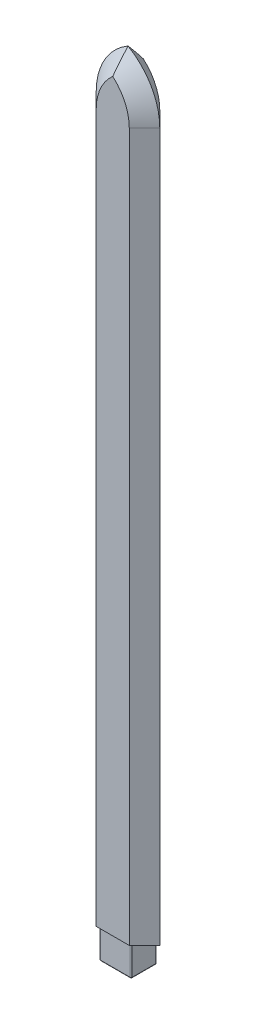
ISO-10303-21;
HEADER;
FILE_DESCRIPTION(('STEP AP214'),'2;1');
FILE_NAME('part.step','',(''),(''),'','','');
FILE_SCHEMA(('AUTOMOTIVE_DESIGN { 1 0 10303 214 1 1 1 1 }'));
ENDSEC;
DATA;
#1=APPLICATION_CONTEXT('core data for automotive mechanical design processes');
#2=APPLICATION_PROTOCOL_DEFINITION('international standard','automotive_design',2000,#1);
#3=PRODUCT_CONTEXT('',#1,'mechanical');
#4=PRODUCT('Part','Part','',(#3));
#5=PRODUCT_RELATED_PRODUCT_CATEGORY('part','',(#4));
#6=PRODUCT_DEFINITION_FORMATION('','',#4);
#7=PRODUCT_DEFINITION_CONTEXT('part definition',#1,'design');
#8=PRODUCT_DEFINITION('design','',#6,#7);
#9=PRODUCT_DEFINITION_SHAPE('','',#8);
#10=(LENGTH_UNIT() NAMED_UNIT(*) SI_UNIT(.MILLI.,.METRE.));
#11=(NAMED_UNIT(*) PLANE_ANGLE_UNIT() SI_UNIT($,.RADIAN.));
#12=(NAMED_UNIT(*) SI_UNIT($,.STERADIAN.) SOLID_ANGLE_UNIT());
#13=UNCERTAINTY_MEASURE_WITH_UNIT(LENGTH_MEASURE(1.E-05),#10,'distance_accuracy_value','');
#14=(GEOMETRIC_REPRESENTATION_CONTEXT(3) GLOBAL_UNCERTAINTY_ASSIGNED_CONTEXT((#13)) GLOBAL_UNIT_ASSIGNED_CONTEXT((#10,
#11,#12)) REPRESENTATION_CONTEXT('',''));
#15=CARTESIAN_POINT('',(0.,0.,0.));
#16=DIRECTION('',(0.,0.,1.));
#17=DIRECTION('',(1.,0.,0.));
#18=AXIS2_PLACEMENT_3D('',#15,#16,#17);
#19=CARTESIAN_POINT('',(0.,-12.192,0.));
#20=DIRECTION('',(0.,1.,0.));
#21=DIRECTION('',(0.,0.,1.));
#22=AXIS2_PLACEMENT_3D('',#19,#20,#21);
#23=PLANE('',#22);
#24=DIRECTION('',(-1.,0.,0.));
#25=VECTOR('',#24,1.);
#26=CARTESIAN_POINT('',(0.,-12.192,4.699));
#27=LINE('',#26,#25);
#28=CARTESIAN_POINT('',(5.969,-12.192,4.699));
#29=VERTEX_POINT('',#28);
#30=CARTESIAN_POINT('',(0.775116281599096,-12.192,4.699));
#31=VERTEX_POINT('',#30);
#32=EDGE_CURVE('E214',#29,#31,#27,.T.);
#33=ORIENTED_EDGE('',*,*,#32,.T.);
#34=CARTESIAN_POINT('',(0.,-12.192,0.));
#35=DIRECTION('',(0.,-1.,0.));
#36=DIRECTION('',(0.,0.,-1.));
#37=AXIS2_PLACEMENT_3D('',#34,#35,#36);
#38=CIRCLE('',#37,4.7625);
#39=CARTESIAN_POINT('',(0.775116281599096,-12.192,-4.699));
#40=VERTEX_POINT('',#39);
#41=EDGE_CURVE('E53',#40,#31,#38,.T.);
#42=ORIENTED_EDGE('',*,*,#41,.F.);
#43=DIRECTION('',(1.,0.,0.));
#44=VECTOR('',#43,1.);
#45=CARTESIAN_POINT('',(0.,-12.192,-4.699));
#46=LINE('',#45,#44);
#47=CARTESIAN_POINT('',(5.969,-12.192,-4.699));
#48=VERTEX_POINT('',#47);
#49=EDGE_CURVE('E41',#40,#48,#46,.T.);
#50=ORIENTED_EDGE('',*,*,#49,.T.);
#51=DIRECTION('',(0.,0.,1.));
#52=VECTOR('',#51,1.);
#53=CARTESIAN_POINT('',(5.969,-12.192,0.));
#54=LINE('',#53,#52);
#55=EDGE_CURVE('E223',#48,#29,#54,.T.);
#56=ORIENTED_EDGE('',*,*,#55,.T.);
#57=EDGE_LOOP('',(#33,#42,#50,#56));
#58=FACE_BOUND('',#57,.T.);
#59=ADVANCED_FACE('F37',(#58),#23,.F.);
#60=CARTESIAN_POINT('',(12.7,0.,6.096));
#61=DIRECTION('',(0.,1.,0.));
#62=DIRECTION('',(0.,0.,1.));
#63=AXIS2_PLACEMENT_3D('',#60,#61,#62);
#64=PLANE('',#63);
#65=CARTESIAN_POINT('',(-5.969,0.,4.699));
#66=DIRECTION('',(0.,1.,0.));
#67=DIRECTION('',(0.,0.,1.));
#68=AXIS2_PLACEMENT_3D('',#65,#66,#67);
#69=CIRCLE('',#68,0.762);
#70=CARTESIAN_POINT('',(-5.969,0.,5.461));
#71=VERTEX_POINT('',#70);
#72=CARTESIAN_POINT('',(-6.731,0.,4.699));
#73=VERTEX_POINT('',#72);
#74=EDGE_CURVE('E459',#71,#73,#69,.F.);
#75=ORIENTED_EDGE('',*,*,#74,.F.);
#76=DIRECTION('',(-1.,0.,0.));
#77=VECTOR('',#76,1.);
#78=CARTESIAN_POINT('',(6.35,0.,5.461));
#79=LINE('',#78,#77);
#80=CARTESIAN_POINT('',(5.969,0.,5.461));
#81=VERTEX_POINT('',#80);
#82=EDGE_CURVE('E487',#71,#81,#79,.F.);
#83=ORIENTED_EDGE('',*,*,#82,.T.);
#84=CARTESIAN_POINT('',(5.969,0.,4.699));
#85=DIRECTION('',(0.,1.,0.));
#86=DIRECTION('',(0.,0.,1.));
#87=AXIS2_PLACEMENT_3D('',#84,#85,#86);
#88=CIRCLE('',#87,0.762);
#89=CARTESIAN_POINT('',(6.731,0.,4.699));
#90=VERTEX_POINT('',#89);
#91=EDGE_CURVE('E485',#90,#81,#88,.F.);
#92=ORIENTED_EDGE('',*,*,#91,.F.);
#93=DIRECTION('',(0.,0.,1.));
#94=VECTOR('',#93,1.);
#95=CARTESIAN_POINT('',(6.731,0.,-5.08));
#96=LINE('',#95,#94);
#97=CARTESIAN_POINT('',(6.731,0.,-4.699));
#98=VERTEX_POINT('',#97);
#99=EDGE_CURVE('E483',#90,#98,#96,.F.);
#100=ORIENTED_EDGE('',*,*,#99,.T.);
#101=CARTESIAN_POINT('',(5.969,0.,-4.699));
#102=DIRECTION('',(0.,1.,0.));
#103=DIRECTION('',(0.,0.,1.));
#104=AXIS2_PLACEMENT_3D('',#101,#102,#103);
#105=CIRCLE('',#104,0.762);
#106=CARTESIAN_POINT('',(5.969,0.,-5.461));
#107=VERTEX_POINT('',#106);
#108=EDGE_CURVE('E480',#107,#98,#105,.F.);
#109=ORIENTED_EDGE('',*,*,#108,.F.);
#110=DIRECTION('',(1.,0.,0.));
#111=VECTOR('',#110,1.);
#112=CARTESIAN_POINT('',(-6.35,0.,-5.461));
#113=LINE('',#112,#111);
#114=CARTESIAN_POINT('',(-5.969,0.,-5.461));
#115=VERTEX_POINT('',#114);
#116=EDGE_CURVE('E478',#107,#115,#113,.F.);
#117=ORIENTED_EDGE('',*,*,#116,.T.);
#118=CARTESIAN_POINT('',(-5.969,0.,-4.699));
#119=DIRECTION('',(0.,1.,0.));
#120=DIRECTION('',(0.,0.,1.));
#121=AXIS2_PLACEMENT_3D('',#118,#119,#120);
#122=CIRCLE('',#121,0.762);
#123=CARTESIAN_POINT('',(-6.731,0.,-4.699));
#124=VERTEX_POINT('',#123);
#125=EDGE_CURVE('E476',#124,#115,#122,.F.);
#126=ORIENTED_EDGE('',*,*,#125,.F.);
#127=DIRECTION('',(0.,0.,-1.));
#128=VECTOR('',#127,1.);
#129=CARTESIAN_POINT('',(-6.731,0.,5.08));
#130=LINE('',#129,#128);
#131=EDGE_CURVE('E424',#124,#73,#130,.F.);
#132=ORIENTED_EDGE('',*,*,#131,.T.);
#133=EDGE_LOOP('',(#75,#83,#92,#100,#109,#117,#126,#132));
#134=FACE_BOUND('',#133,.T.);
#135=DIRECTION('',(0.707106781186546,0.,0.707106781186549));
#136=VECTOR('',#135,1.);
#137=CARTESIAN_POINT('',(-6.60400000000004,0.,6.09600000000001));
#138=LINE('',#137,#136);
#139=CARTESIAN_POINT('',(-6.60400000000005,0.,6.096));
#140=VERTEX_POINT('',#139);
#141=CARTESIAN_POINT('',(-12.7,0.,0.));
#142=VERTEX_POINT('',#141);
#143=EDGE_CURVE('E615',#140,#142,#138,.F.);
#144=ORIENTED_EDGE('',*,*,#143,.T.);
#145=DIRECTION('',(0.707106781186549,0.,-0.707106781186546));
#146=VECTOR('',#145,1.);
#147=CARTESIAN_POINT('',(-12.7,0.,0.));
#148=LINE('',#147,#146);
#149=CARTESIAN_POINT('',(-6.60400000000002,0.,-6.096));
#150=VERTEX_POINT('',#149);
#151=EDGE_CURVE('E622',#142,#150,#148,.T.);
#152=ORIENTED_EDGE('',*,*,#151,.T.);
#153=DIRECTION('',(1.,0.,0.));
#154=VECTOR('',#153,1.);
#155=CARTESIAN_POINT('',(12.7,0.,-6.096));
#156=LINE('',#155,#154);
#157=CARTESIAN_POINT('',(6.60399999999997,0.,-6.096));
#158=VERTEX_POINT('',#157);
#159=EDGE_CURVE('E649',#150,#158,#156,.T.);
#160=ORIENTED_EDGE('',*,*,#159,.T.);
#161=DIRECTION('',(0.707106781186549,0.,0.707106781186546));
#162=VECTOR('',#161,1.);
#163=CARTESIAN_POINT('',(12.7,0.,0.));
#164=LINE('',#163,#162);
#165=CARTESIAN_POINT('',(12.7,0.,0.));
#166=VERTEX_POINT('',#165);
#167=EDGE_CURVE('E605',#158,#166,#164,.T.);
#168=ORIENTED_EDGE('',*,*,#167,.T.);
#169=DIRECTION('',(0.707106781186546,0.,-0.707106781186549));
#170=VECTOR('',#169,1.);
#171=CARTESIAN_POINT('',(6.60400000000001,0.,6.09600000000001));
#172=LINE('',#171,#170);
#173=CARTESIAN_POINT('',(6.60400000000002,0.,6.096));
#174=VERTEX_POINT('',#173);
#175=EDGE_CURVE('E612',#166,#174,#172,.F.);
#176=ORIENTED_EDGE('',*,*,#175,.T.);
#177=DIRECTION('',(1.,0.,0.));
#178=VECTOR('',#177,1.);
#179=CARTESIAN_POINT('',(12.7,0.,6.096));
#180=LINE('',#179,#178);
#181=EDGE_CURVE('E648',#140,#174,#180,.T.);
#182=ORIENTED_EDGE('',*,*,#181,.F.);
#183=EDGE_LOOP('',(#144,#152,#160,#168,#176,#182));
#184=FACE_BOUND('',#183,.T.);
#185=ADVANCED_FACE('F274',(#134,#184),#64,.F.);
#186=CARTESIAN_POINT('',(12.7,282.8036,6.096));
#187=DIRECTION('',(0.,0.,-1.));
#188=DIRECTION('',(-1.,0.,0.));
#189=AXIS2_PLACEMENT_3D('',#186,#187,#188);
#190=PLANE('',#189);
#191=CARTESIAN_POINT('',(12.7,282.8036,6.096));
#192=DIRECTION('',(0.,0.,-1.));
#193=DIRECTION('',(-1.,0.,0.));
#194=AXIS2_PLACEMENT_3D('',#191,#192,#193);
#195=CIRCLE('',#194,19.304);
#196=CARTESIAN_POINT('',(0.,297.341633429594,6.096));
#197=VERTEX_POINT('',#196);
#198=CARTESIAN_POINT('',(-6.60400000000002,282.8036,6.096));
#199=VERTEX_POINT('',#198);
#200=EDGE_CURVE('E228',#197,#199,#195,.F.);
#201=ORIENTED_EDGE('',*,*,#200,.T.);
#202=DIRECTION('',(0.,-1.,0.));
#203=VECTOR('',#202,1.);
#204=CARTESIAN_POINT('',(-6.60400000000002,282.8036,6.096));
#205=LINE('',#204,#203);
#206=EDGE_CURVE('E224',#199,#140,#205,.T.);
#207=ORIENTED_EDGE('',*,*,#206,.T.);
#208=ORIENTED_EDGE('',*,*,#181,.T.);
#209=DIRECTION('',(0.,1.,0.));
#210=VECTOR('',#209,1.);
#211=CARTESIAN_POINT('',(6.60399999999999,282.8036,6.096));
#212=LINE('',#211,#210);
#213=CARTESIAN_POINT('',(6.60399999999999,282.8036,6.096));
#214=VERTEX_POINT('',#213);
#215=EDGE_CURVE('E624',#174,#214,#212,.T.);
#216=ORIENTED_EDGE('',*,*,#215,.T.);
#217=CARTESIAN_POINT('',(-12.7,282.8036,6.096));
#218=DIRECTION('',(0.,0.,-1.));
#219=DIRECTION('',(-1.,0.,0.));
#220=AXIS2_PLACEMENT_3D('',#217,#218,#219);
#221=CIRCLE('',#220,19.304);
#222=EDGE_CURVE('E626',#214,#197,#221,.F.);
#223=ORIENTED_EDGE('',*,*,#222,.T.);
#224=EDGE_LOOP('',(#201,#207,#208,#216,#223));
#225=FACE_BOUND('',#224,.T.);
#226=ADVANCED_FACE('F279',(#225),#190,.F.);
#227=CARTESIAN_POINT('',(12.7,282.8036,-6.096));
#228=DIRECTION('',(0.,0.,-1.));
#229=DIRECTION('',(-1.,0.,0.));
#230=AXIS2_PLACEMENT_3D('',#227,#228,#229);
#231=PLANE('',#230);
#232=ORIENTED_EDGE('',*,*,#159,.F.);
#233=DIRECTION('',(0.,1.,0.));
#234=VECTOR('',#233,1.);
#235=CARTESIAN_POINT('',(-6.60399999999999,282.8036,-6.096));
#236=LINE('',#235,#234);
#237=CARTESIAN_POINT('',(-6.60399999999998,282.8036,-6.096));
#238=VERTEX_POINT('',#237);
#239=EDGE_CURVE('E613',#150,#238,#236,.T.);
#240=ORIENTED_EDGE('',*,*,#239,.T.);
#241=CARTESIAN_POINT('',(12.7,282.8036,-6.096));
#242=DIRECTION('',(0.,0.,-1.));
#243=DIRECTION('',(-1.,0.,0.));
#244=AXIS2_PLACEMENT_3D('',#241,#242,#243);
#245=CIRCLE('',#244,19.304);
#246=CARTESIAN_POINT('',(0.,297.341633429594,-6.096));
#247=VERTEX_POINT('',#246);
#248=EDGE_CURVE('E617',#238,#247,#245,.T.);
#249=ORIENTED_EDGE('',*,*,#248,.T.);
#250=CARTESIAN_POINT('',(-12.7,282.8036,-6.096));
#251=DIRECTION('',(0.,0.,-1.));
#252=DIRECTION('',(-1.,0.,0.));
#253=AXIS2_PLACEMENT_3D('',#250,#251,#252);
#254=CIRCLE('',#253,19.304);
#255=CARTESIAN_POINT('',(6.60399999999994,282.8036,-6.096));
#256=VERTEX_POINT('',#255);
#257=EDGE_CURVE('E640',#247,#256,#254,.T.);
#258=ORIENTED_EDGE('',*,*,#257,.T.);
#259=DIRECTION('',(0.,-1.,0.));
#260=VECTOR('',#259,1.);
#261=CARTESIAN_POINT('',(6.60399999999997,0.,-6.096));
#262=LINE('',#261,#260);
#263=EDGE_CURVE('E607',#256,#158,#262,.T.);
#264=ORIENTED_EDGE('',*,*,#263,.T.);
#265=EDGE_LOOP('',(#232,#240,#249,#258,#264));
#266=FACE_BOUND('',#265,.T.);
#267=ADVANCED_FACE('F529',(#266),#231,.T.);
#268=CARTESIAN_POINT('',(6.60399999999999,282.8036,6.096));
#269=DIRECTION('',(-0.707106781186549,0.,-0.707106781186546));
#270=DIRECTION('',(0.,1.,0.));
#271=AXIS2_PLACEMENT_3D('',#268,#269,#270);
#272=PLANE('',#271);
#273=ORIENTED_EDGE('',*,*,#215,.F.);
#274=ORIENTED_EDGE('',*,*,#175,.F.);
#275=DIRECTION('',(0.,-1.,0.));
#276=VECTOR('',#275,1.);
#277=CARTESIAN_POINT('',(12.7,282.8036,0.));
#278=LINE('',#277,#276);
#279=CARTESIAN_POINT('',(12.7,282.8036,0.));
#280=VERTEX_POINT('',#279);
#281=EDGE_CURVE('E231',#280,#166,#278,.T.);
#282=ORIENTED_EDGE('',*,*,#281,.F.);
#283=DIRECTION('',(0.707106781186546,0.,-0.707106781186549));
#284=VECTOR('',#283,1.);
#285=CARTESIAN_POINT('',(6.60399999999999,282.8036,6.096));
#286=LINE('',#285,#284);
#287=EDGE_CURVE('E884',#214,#280,#286,.T.);
#288=ORIENTED_EDGE('',*,*,#287,.F.);
#289=EDGE_LOOP('',(#273,#274,#282,#288));
#290=FACE_BOUND('',#289,.T.);
#291=ADVANCED_FACE('F371',(#290),#272,.F.);
#292=CARTESIAN_POINT('',(12.7,282.8036,0.));
#293=DIRECTION('',(0.707106781186546,0.,-0.707106781186549));
#294=DIRECTION('',(0.,-1.,0.));
#295=AXIS2_PLACEMENT_3D('',#292,#293,#294);
#296=PLANE('',#295);
#297=ORIENTED_EDGE('',*,*,#167,.F.);
#298=ORIENTED_EDGE('',*,*,#263,.F.);
#299=DIRECTION('',(-0.707106781186549,0.,-0.707106781186546));
#300=VECTOR('',#299,1.);
#301=CARTESIAN_POINT('',(12.7,282.8036,0.));
#302=LINE('',#301,#300);
#303=EDGE_CURVE('E642',#280,#256,#302,.T.);
#304=ORIENTED_EDGE('',*,*,#303,.F.);
#305=ORIENTED_EDGE('',*,*,#281,.T.);
#306=EDGE_LOOP('',(#297,#298,#304,#305));
#307=FACE_BOUND('',#306,.T.);
#308=ADVANCED_FACE('F591',(#307),#296,.T.);
#309=CARTESIAN_POINT('',(-12.7,282.8036,6.096));
#310=DIRECTION('',(0.,0.,-1.));
#311=DIRECTION('',(-1.,0.,0.));
#312=AXIS2_PLACEMENT_3D('',#309,#310,#311);
#313=CONICAL_SURFACE('',#312,19.304,0.785398163397446);
#314=ORIENTED_EDGE('',*,*,#222,.F.);
#315=ORIENTED_EDGE('',*,*,#287,.T.);
#316=CARTESIAN_POINT('',(-12.7,282.8036,0.));
#317=DIRECTION('',(0.,0.,-1.));
#318=DIRECTION('',(-1.,0.,0.));
#319=AXIS2_PLACEMENT_3D('',#316,#317,#318);
#320=CIRCLE('',#319,25.4);
#321=CARTESIAN_POINT('',(0.,304.800645256125,0.));
#322=VERTEX_POINT('',#321);
#323=EDGE_CURVE('E572',#322,#280,#320,.T.);
#324=ORIENTED_EDGE('',*,*,#323,.F.);
#325=CARTESIAN_POINT('',(0.,304.800645256125,0.));
#326=CARTESIAN_POINT('',(0.,304.497146677909,0.262832821845056));
#327=CARTESIAN_POINT('',(0.,304.192981284702,0.524893983363243));
#328=CARTESIAN_POINT('',(0.,303.583155470929,1.04727621377784));
#329=CARTESIAN_POINT('',(0.,303.277495036906,1.30759726696008));
#330=CARTESIAN_POINT('',(0.,302.358212854526,2.08549945285016));
#331=CARTESIAN_POINT('',(0.,301.742116562755,2.6001703908839));
#332=CARTESIAN_POINT('',(0.,300.811784273223,3.36471853820326));
#333=CARTESIAN_POINT('',(0.,300.500622578787,3.61834048095647));
#334=CARTESIAN_POINT('',(0.,299.875990660825,4.12272203765043));
#335=CARTESIAN_POINT('',(0.,299.562520460468,4.37348168025367));
#336=CARTESIAN_POINT('',(0.,298.932899204769,4.87179545091354));
#337=CARTESIAN_POINT('',(0.,298.616747438551,5.11934868202647));
#338=CARTESIAN_POINT('',(0.,297.981489823222,5.61065767468526));
#339=CARTESIAN_POINT('',(0.,297.662383865651,5.85441329591868));
#340=CARTESIAN_POINT('',(0.,297.341633429594,6.09600000000001));
#341=B_SPLINE_CURVE_WITH_KNOTS('',3,(#325,#326,#327,#328,#329,#330,#331,#332,#333,#334,#335,
#336,#337,#338,#339,#340),.UNSPECIFIED.,.F.,.F.,(4,2,2,2,2,2,2,4),(0.,1.20445920643655,
2.40892927516814,4.81717949598103,6.02145500910871,7.2257184522742,8.43031179397944,
9.63494953742671),.UNSPECIFIED.);
#342=EDGE_CURVE('E563',#197,#322,#341,.F.);
#343=ORIENTED_EDGE('',*,*,#342,.F.);
#344=EDGE_LOOP('',(#314,#315,#324,#343));
#345=FACE_BOUND('',#344,.T.);
#346=ADVANCED_FACE('F575',(#345),#313,.T.);
#347=CARTESIAN_POINT('',(-6.60400000000002,282.8036,6.096));
#348=DIRECTION('',(0.707106781186549,0.,-0.707106781186546));
#349=DIRECTION('',(0.,-1.,0.));
#350=AXIS2_PLACEMENT_3D('',#347,#348,#349);
#351=PLANE('',#350);
#352=ORIENTED_EDGE('',*,*,#143,.F.);
#353=ORIENTED_EDGE('',*,*,#206,.F.);
#354=DIRECTION('',(0.707106781186546,0.,0.707106781186549));
#355=VECTOR('',#354,1.);
#356=CARTESIAN_POINT('',(-12.7,282.8036,0.));
#357=LINE('',#356,#355);
#358=CARTESIAN_POINT('',(-12.7,282.8036,0.));
#359=VERTEX_POINT('',#358);
#360=EDGE_CURVE('E560',#359,#199,#357,.T.);
#361=ORIENTED_EDGE('',*,*,#360,.F.);
#362=DIRECTION('',(0.,1.,0.));
#363=VECTOR('',#362,1.);
#364=CARTESIAN_POINT('',(-12.7,0.,0.));
#365=LINE('',#364,#363);
#366=EDGE_CURVE('E555',#142,#359,#365,.T.);
#367=ORIENTED_EDGE('',*,*,#366,.F.);
#368=EDGE_LOOP('',(#352,#353,#361,#367));
#369=FACE_BOUND('',#368,.T.);
#370=ADVANCED_FACE('F543',(#369),#351,.F.);
#371=CARTESIAN_POINT('',(-12.7,282.8036,0.));
#372=DIRECTION('',(0.,0.,1.));
#373=DIRECTION('',(1.,0.,0.));
#374=AXIS2_PLACEMENT_3D('',#371,#372,#373);
#375=CONICAL_SURFACE('',#374,25.4,0.785398163397451);
#376=ORIENTED_EDGE('',*,*,#303,.T.);
#377=ORIENTED_EDGE('',*,*,#257,.F.);
#378=CARTESIAN_POINT('',(0.,297.341633429594,-6.096));
#379=CARTESIAN_POINT('',(0.,297.662383865651,-5.85441329591868));
#380=CARTESIAN_POINT('',(0.,297.981489823222,-5.61065767468525));
#381=CARTESIAN_POINT('',(0.,298.616747438551,-5.11934868202647));
#382=CARTESIAN_POINT('',(0.,298.932899204769,-4.87179545091354));
#383=CARTESIAN_POINT('',(0.,299.562520460468,-4.37348168025368));
#384=CARTESIAN_POINT('',(0.,299.875990660825,-4.12272203765044));
#385=CARTESIAN_POINT('',(0.,300.500622578787,-3.61834048095646));
#386=CARTESIAN_POINT('',(0.,300.811784273223,-3.36471853820324));
#387=CARTESIAN_POINT('',(0.,301.742116562755,-2.60017039088389));
#388=CARTESIAN_POINT('',(0.,302.358212854526,-2.08549945285016));
#389=CARTESIAN_POINT('',(0.,303.277495036906,-1.30759726696009));
#390=CARTESIAN_POINT('',(0.,303.583155470929,-1.04727621377785));
#391=CARTESIAN_POINT('',(0.,304.192981284702,-0.524893983363256));
#392=CARTESIAN_POINT('',(0.,304.497146677909,-0.262832821845071));
#393=CARTESIAN_POINT('',(0.,304.800645256125,0.));
#394=B_SPLINE_CURVE_WITH_KNOTS('',3,(#378,#379,#380,#381,#382,#383,#384,#385,#386,#387,#388,
#389,#390,#391,#392,#393),.UNSPECIFIED.,.F.,.F.,(4,2,2,2,2,2,2,4),(0.,1.20463774344732,
2.40923108515249,3.61349452831804,4.81777004144572,7.22602026225861,8.43049033099019,
9.63494953742673),.UNSPECIFIED.);
#395=EDGE_CURVE('E548',#322,#247,#394,.F.);
#396=ORIENTED_EDGE('',*,*,#395,.F.);
#397=ORIENTED_EDGE('',*,*,#323,.T.);
#398=EDGE_LOOP('',(#376,#377,#396,#397));
#399=FACE_BOUND('',#398,.T.);
#400=ADVANCED_FACE('F535',(#399),#375,.T.);
#401=CARTESIAN_POINT('',(12.7,282.8036,6.096));
#402=DIRECTION('',(0.,0.,-1.));
#403=DIRECTION('',(-1.,0.,0.));
#404=AXIS2_PLACEMENT_3D('',#401,#402,#403);
#405=CONICAL_SURFACE('',#404,19.304,0.785398163397446);
#406=ORIENTED_EDGE('',*,*,#200,.F.);
#407=ORIENTED_EDGE('',*,*,#342,.T.);
#408=CARTESIAN_POINT('',(12.7,282.8036,0.));
#409=DIRECTION('',(0.,0.,-1.));
#410=DIRECTION('',(-1.,0.,0.));
#411=AXIS2_PLACEMENT_3D('',#408,#409,#410);
#412=CIRCLE('',#411,25.4);
#413=EDGE_CURVE('E556',#359,#322,#412,.T.);
#414=ORIENTED_EDGE('',*,*,#413,.F.);
#415=ORIENTED_EDGE('',*,*,#360,.T.);
#416=EDGE_LOOP('',(#406,#407,#414,#415));
#417=FACE_BOUND('',#416,.T.);
#418=ADVANCED_FACE('F542',(#417),#405,.T.);
#419=CARTESIAN_POINT('',(-12.7,0.,0.));
#420=DIRECTION('',(-0.707106781186546,0.,-0.707106781186549));
#421=DIRECTION('',(0.,1.,0.));
#422=AXIS2_PLACEMENT_3D('',#419,#420,#421);
#423=PLANE('',#422);
#424=ORIENTED_EDGE('',*,*,#151,.F.);
#425=ORIENTED_EDGE('',*,*,#366,.T.);
#426=DIRECTION('',(-0.707106781186549,0.,0.707106781186546));
#427=VECTOR('',#426,1.);
#428=CARTESIAN_POINT('',(-6.60399999999999,282.8036,-6.096));
#429=LINE('',#428,#427);
#430=EDGE_CURVE('E352',#238,#359,#429,.T.);
#431=ORIENTED_EDGE('',*,*,#430,.F.);
#432=ORIENTED_EDGE('',*,*,#239,.F.);
#433=EDGE_LOOP('',(#424,#425,#431,#432));
#434=FACE_BOUND('',#433,.T.);
#435=ADVANCED_FACE('F584',(#434),#423,.T.);
#436=CARTESIAN_POINT('',(12.7,282.8036,0.));
#437=DIRECTION('',(0.,0.,1.));
#438=DIRECTION('',(1.,0.,0.));
#439=AXIS2_PLACEMENT_3D('',#436,#437,#438);
#440=CONICAL_SURFACE('',#439,25.4,0.785398163397451);
#441=ORIENTED_EDGE('',*,*,#395,.T.);
#442=ORIENTED_EDGE('',*,*,#248,.F.);
#443=ORIENTED_EDGE('',*,*,#430,.T.);
#444=ORIENTED_EDGE('',*,*,#413,.T.);
#445=EDGE_LOOP('',(#441,#442,#443,#444));
#446=FACE_BOUND('',#445,.T.);
#447=ADVANCED_FACE('F525',(#446),#440,.T.);
#448=CARTESIAN_POINT('',(6.35,-12.192,-5.08));
#449=DIRECTION('',(-1.,0.,0.));
#450=DIRECTION('',(0.,0.,1.));
#451=AXIS2_PLACEMENT_3D('',#448,#449,#450);
#452=PLANE('',#451);
#453=DIRECTION('',(0.,1.,0.));
#454=VECTOR('',#453,1.);
#455=CARTESIAN_POINT('',(6.35,-12.192,4.699));
#456=LINE('',#455,#454);
#457=CARTESIAN_POINT('',(6.35,-0.381000000000005,4.699));
#458=VERTEX_POINT('',#457);
#459=CARTESIAN_POINT('',(6.35,-11.811,4.699));
#460=VERTEX_POINT('',#459);
#461=EDGE_CURVE('E494',#458,#460,#456,.F.);
#462=ORIENTED_EDGE('',*,*,#461,.T.);
#463=DIRECTION('',(0.,0.,1.));
#464=VECTOR('',#463,1.);
#465=CARTESIAN_POINT('',(6.35,-11.811,-5.08));
#466=LINE('',#465,#464);
#467=CARTESIAN_POINT('',(6.35,-11.811,-4.699));
#468=VERTEX_POINT('',#467);
#469=EDGE_CURVE('E496',#460,#468,#466,.F.);
#470=ORIENTED_EDGE('',*,*,#469,.T.);
#471=DIRECTION('',(0.,1.,0.));
#472=VECTOR('',#471,1.);
#473=CARTESIAN_POINT('',(6.35,-12.192,-4.699));
#474=LINE('',#473,#472);
#475=CARTESIAN_POINT('',(6.35,-0.381000000000005,-4.699));
#476=VERTEX_POINT('',#475);
#477=EDGE_CURVE('E490',#468,#476,#474,.T.);
#478=ORIENTED_EDGE('',*,*,#477,.T.);
#479=DIRECTION('',(0.,0.,1.));
#480=VECTOR('',#479,1.);
#481=CARTESIAN_POINT('',(6.35,-0.381000000000005,5.08));
#482=LINE('',#481,#480);
#483=EDGE_CURVE('E492',#476,#458,#482,.T.);
#484=ORIENTED_EDGE('',*,*,#483,.T.);
#485=EDGE_LOOP('',(#462,#470,#478,#484));
#486=FACE_BOUND('',#485,.T.);
#487=ADVANCED_FACE('F520',(#486),#452,.F.);
#488=CARTESIAN_POINT('',(-6.35,-12.192,5.08));
#489=DIRECTION('',(0.,0.,-1.));
#490=DIRECTION('',(-1.,0.,0.));
#491=AXIS2_PLACEMENT_3D('',#488,#489,#490);
#492=PLANE('',#491);
#493=DIRECTION('',(-1.,0.,0.));
#494=VECTOR('',#493,1.);
#495=CARTESIAN_POINT('',(-6.35,-11.811,5.08));
#496=LINE('',#495,#494);
#497=CARTESIAN_POINT('',(-5.969,-11.811,5.08));
#498=VERTEX_POINT('',#497);
#499=CARTESIAN_POINT('',(5.969,-11.811,5.08));
#500=VERTEX_POINT('',#499);
#501=EDGE_CURVE('E460',#498,#500,#496,.F.);
#502=ORIENTED_EDGE('',*,*,#501,.T.);
#503=DIRECTION('',(0.,1.,0.));
#504=VECTOR('',#503,1.);
#505=CARTESIAN_POINT('',(5.969,-12.192,5.08));
#506=LINE('',#505,#504);
#507=CARTESIAN_POINT('',(5.969,-0.381000000000005,5.08));
#508=VERTEX_POINT('',#507);
#509=EDGE_CURVE('E454',#500,#508,#506,.T.);
#510=ORIENTED_EDGE('',*,*,#509,.T.);
#511=DIRECTION('',(-1.,0.,0.));
#512=VECTOR('',#511,1.);
#513=CARTESIAN_POINT('',(-6.35,-0.381000000000005,5.08));
#514=LINE('',#513,#512);
#515=CARTESIAN_POINT('',(-5.969,-0.381000000000005,5.08));
#516=VERTEX_POINT('',#515);
#517=EDGE_CURVE('E468',#508,#516,#514,.T.);
#518=ORIENTED_EDGE('',*,*,#517,.T.);
#519=DIRECTION('',(0.,1.,0.));
#520=VECTOR('',#519,1.);
#521=CARTESIAN_POINT('',(-5.969,-12.192,5.08));
#522=LINE('',#521,#520);
#523=EDGE_CURVE('E465',#516,#498,#522,.F.);
#524=ORIENTED_EDGE('',*,*,#523,.T.);
#525=EDGE_LOOP('',(#502,#510,#518,#524));
#526=FACE_BOUND('',#525,.T.);
#527=ADVANCED_FACE('F463',(#526),#492,.F.);
#528=CARTESIAN_POINT('',(-6.35,-12.192,-5.08));
#529=DIRECTION('',(1.,0.,0.));
#530=DIRECTION('',(0.,0.,-1.));
#531=AXIS2_PLACEMENT_3D('',#528,#529,#530);
#532=PLANE('',#531);
#533=DIRECTION('',(0.,0.,-1.));
#534=VECTOR('',#533,1.);
#535=CARTESIAN_POINT('',(-6.35,-11.811,-5.08));
#536=LINE('',#535,#534);
#537=CARTESIAN_POINT('',(-6.35,-11.811,-4.699));
#538=VERTEX_POINT('',#537);
#539=CARTESIAN_POINT('',(-6.35,-11.811,4.699));
#540=VERTEX_POINT('',#539);
#541=EDGE_CURVE('E61',#538,#540,#536,.F.);
#542=ORIENTED_EDGE('',*,*,#541,.T.);
#543=DIRECTION('',(0.,1.,0.));
#544=VECTOR('',#543,1.);
#545=CARTESIAN_POINT('',(-6.35,-12.192,4.699));
#546=LINE('',#545,#544);
#547=CARTESIAN_POINT('',(-6.35,-0.381000000000005,4.699));
#548=VERTEX_POINT('',#547);
#549=EDGE_CURVE('E47',#540,#548,#546,.T.);
#550=ORIENTED_EDGE('',*,*,#549,.T.);
#551=DIRECTION('',(0.,0.,-1.));
#552=VECTOR('',#551,1.);
#553=CARTESIAN_POINT('',(-6.35,-0.381000000000005,-5.08));
#554=LINE('',#553,#552);
#555=CARTESIAN_POINT('',(-6.35,-0.381000000000005,-4.699));
#556=VERTEX_POINT('',#555);
#557=EDGE_CURVE('E423',#548,#556,#554,.T.);
#558=ORIENTED_EDGE('',*,*,#557,.T.);
#559=DIRECTION('',(0.,1.,0.));
#560=VECTOR('',#559,1.);
#561=CARTESIAN_POINT('',(-6.35,-12.192,-4.699));
#562=LINE('',#561,#560);
#563=EDGE_CURVE('E428',#556,#538,#562,.F.);
#564=ORIENTED_EDGE('',*,*,#563,.T.);
#565=EDGE_LOOP('',(#542,#550,#558,#564));
#566=FACE_BOUND('',#565,.T.);
#567=ADVANCED_FACE('F289',(#566),#532,.F.);
#568=CARTESIAN_POINT('',(-6.35,-12.192,-5.08));
#569=DIRECTION('',(0.,0.,1.));
#570=DIRECTION('',(1.,0.,0.));
#571=AXIS2_PLACEMENT_3D('',#568,#569,#570);
#572=PLANE('',#571);
#573=DIRECTION('',(0.,1.,0.));
#574=VECTOR('',#573,1.);
#575=CARTESIAN_POINT('',(5.969,-12.192,-5.08));
#576=LINE('',#575,#574);
#577=CARTESIAN_POINT('',(5.969,-0.381000000000005,-5.08));
#578=VERTEX_POINT('',#577);
#579=CARTESIAN_POINT('',(5.969,-11.811,-5.08));
#580=VERTEX_POINT('',#579);
#581=EDGE_CURVE('E503',#578,#580,#576,.F.);
#582=ORIENTED_EDGE('',*,*,#581,.T.);
#583=DIRECTION('',(1.,0.,0.));
#584=VECTOR('',#583,1.);
#585=CARTESIAN_POINT('',(-6.35,-11.811,-5.08));
#586=LINE('',#585,#584);
#587=CARTESIAN_POINT('',(-5.969,-11.811,-5.08));
#588=VERTEX_POINT('',#587);
#589=EDGE_CURVE('E431',#580,#588,#586,.F.);
#590=ORIENTED_EDGE('',*,*,#589,.T.);
#591=DIRECTION('',(0.,1.,0.));
#592=VECTOR('',#591,1.);
#593=CARTESIAN_POINT('',(-5.969,-12.192,-5.08));
#594=LINE('',#593,#592);
#595=CARTESIAN_POINT('',(-5.969,-0.381000000000005,-5.08));
#596=VERTEX_POINT('',#595);
#597=EDGE_CURVE('E499',#588,#596,#594,.T.);
#598=ORIENTED_EDGE('',*,*,#597,.T.);
#599=DIRECTION('',(1.,0.,0.));
#600=VECTOR('',#599,1.);
#601=CARTESIAN_POINT('',(6.35,-0.381000000000005,-5.08));
#602=LINE('',#601,#600);
#603=EDGE_CURVE('E501',#596,#578,#602,.T.);
#604=ORIENTED_EDGE('',*,*,#603,.T.);
#605=EDGE_LOOP('',(#582,#590,#598,#604));
#606=FACE_BOUND('',#605,.T.);
#607=ADVANCED_FACE('F285',(#606),#572,.F.);
#608=CARTESIAN_POINT('',(-5.969,-12.192,-4.699));
#609=VERTEX_POINT('',#608);
#610=CARTESIAN_POINT('',(-0.775116281599096,-12.192,-4.699));
#611=VERTEX_POINT('',#610);
#612=EDGE_CURVE('E221',#609,#611,#46,.T.);
#613=ORIENTED_EDGE('',*,*,#612,.T.);
#614=CARTESIAN_POINT('',(-0.775116281599096,-12.192,4.699));
#615=VERTEX_POINT('',#614);
#616=EDGE_CURVE('E200',#615,#611,#38,.T.);
#617=ORIENTED_EDGE('',*,*,#616,.F.);
#618=CARTESIAN_POINT('',(-5.969,-12.192,4.699));
#619=VERTEX_POINT('',#618);
#620=EDGE_CURVE('E511',#615,#619,#27,.T.);
#621=ORIENTED_EDGE('',*,*,#620,.T.);
#622=DIRECTION('',(0.,0.,-1.));
#623=VECTOR('',#622,1.);
#624=CARTESIAN_POINT('',(-5.969,-12.192,0.));
#625=LINE('',#624,#623);
#626=EDGE_CURVE('E222',#619,#609,#625,.T.);
#627=ORIENTED_EDGE('',*,*,#626,.T.);
#628=EDGE_LOOP('',(#613,#617,#621,#627));
#629=FACE_BOUND('',#628,.T.);
#630=ADVANCED_FACE('F270',(#629),#23,.F.);
#631=CARTESIAN_POINT('',(-6.35,-0.381000000000005,-5.461));
#632=DIRECTION('',(-1.,0.,0.));
#633=DIRECTION('',(0.,0.,1.));
#634=AXIS2_PLACEMENT_3D('',#631,#632,#633);
#635=CYLINDRICAL_SURFACE('',#634,0.381);
#636=CARTESIAN_POINT('',(-5.969,-0.381000000000005,-5.461));
#637=DIRECTION('',(1.,0.,0.));
#638=DIRECTION('',(0.,0.,-1.));
#639=AXIS2_PLACEMENT_3D('',#636,#637,#638);
#640=CIRCLE('',#639,0.381);
#641=EDGE_CURVE('E347',#115,#596,#640,.T.);
#642=ORIENTED_EDGE('',*,*,#641,.F.);
#643=ORIENTED_EDGE('',*,*,#116,.F.);
#644=CARTESIAN_POINT('',(5.969,-0.381000000000005,-5.461));
#645=DIRECTION('',(-1.,0.,0.));
#646=DIRECTION('',(0.,0.,1.));
#647=AXIS2_PLACEMENT_3D('',#644,#645,#646);
#648=CIRCLE('',#647,0.381);
#649=EDGE_CURVE('E350',#578,#107,#648,.T.);
#650=ORIENTED_EDGE('',*,*,#649,.F.);
#651=ORIENTED_EDGE('',*,*,#603,.F.);
#652=EDGE_LOOP('',(#642,#643,#650,#651));
#653=FACE_BOUND('',#652,.T.);
#654=ADVANCED_FACE('F39',(#653),#635,.F.);
#655=CARTESIAN_POINT('',(5.969,-0.381000000000005,-4.699));
#656=DIRECTION('',(0.,1.,0.));
#657=DIRECTION('',(0.,0.,1.));
#658=AXIS2_PLACEMENT_3D('',#655,#656,#657);
#659=TOROIDAL_SURFACE('',#658,0.762,0.381);
#660=ORIENTED_EDGE('',*,*,#649,.T.);
#661=ORIENTED_EDGE('',*,*,#108,.T.);
#662=CARTESIAN_POINT('',(6.731,-0.381000000000005,-4.699));
#663=DIRECTION('',(0.,0.,1.));
#664=DIRECTION('',(1.,0.,0.));
#665=AXIS2_PLACEMENT_3D('',#662,#663,#664);
#666=CIRCLE('',#665,0.381);
#667=EDGE_CURVE('E344',#476,#98,#666,.F.);
#668=ORIENTED_EDGE('',*,*,#667,.F.);
#669=CARTESIAN_POINT('',(5.969,-0.381000000000005,-4.699));
#670=DIRECTION('',(0.,1.,0.));
#671=DIRECTION('',(0.,0.,1.));
#672=AXIS2_PLACEMENT_3D('',#669,#670,#671);
#673=CIRCLE('',#672,0.381);
#674=EDGE_CURVE('E341',#578,#476,#673,.F.);
#675=ORIENTED_EDGE('',*,*,#674,.F.);
#676=EDGE_LOOP('',(#660,#661,#668,#675));
#677=FACE_BOUND('',#676,.T.);
#678=ADVANCED_FACE('F263',(#677),#659,.F.);
#679=CARTESIAN_POINT('',(-5.969,-0.381000000000005,-4.699));
#680=DIRECTION('',(0.,1.,0.));
#681=DIRECTION('',(0.,0.,1.));
#682=AXIS2_PLACEMENT_3D('',#679,#680,#681);
#683=TOROIDAL_SURFACE('',#682,0.762,0.381);
#684=ORIENTED_EDGE('',*,*,#125,.T.);
#685=ORIENTED_EDGE('',*,*,#641,.T.);
#686=CARTESIAN_POINT('',(-5.969,-0.381000000000005,-4.699));
#687=DIRECTION('',(0.,1.,0.));
#688=DIRECTION('',(0.,0.,1.));
#689=AXIS2_PLACEMENT_3D('',#686,#687,#688);
#690=CIRCLE('',#689,0.381);
#691=EDGE_CURVE('E338',#556,#596,#690,.F.);
#692=ORIENTED_EDGE('',*,*,#691,.F.);
#693=CARTESIAN_POINT('',(-6.731,-0.381000000000005,-4.699));
#694=DIRECTION('',(0.,0.,1.));
#695=DIRECTION('',(1.,0.,0.));
#696=AXIS2_PLACEMENT_3D('',#693,#694,#695);
#697=CIRCLE('',#696,0.381);
#698=EDGE_CURVE('E335',#124,#556,#697,.F.);
#699=ORIENTED_EDGE('',*,*,#698,.F.);
#700=EDGE_LOOP('',(#684,#685,#692,#699));
#701=FACE_BOUND('',#700,.T.);
#702=ADVANCED_FACE('F260',(#701),#683,.F.);
#703=CARTESIAN_POINT('',(6.731,-0.381000000000005,-5.08));
#704=DIRECTION('',(0.,0.,-1.));
#705=DIRECTION('',(-1.,0.,0.));
#706=AXIS2_PLACEMENT_3D('',#703,#704,#705);
#707=CYLINDRICAL_SURFACE('',#706,0.381);
#708=ORIENTED_EDGE('',*,*,#667,.T.);
#709=ORIENTED_EDGE('',*,*,#99,.F.);
#710=CARTESIAN_POINT('',(6.731,-0.381000000000005,4.699));
#711=DIRECTION('',(0.,0.,-1.));
#712=DIRECTION('',(-1.,0.,0.));
#713=AXIS2_PLACEMENT_3D('',#710,#711,#712);
#714=CIRCLE('',#713,0.381);
#715=EDGE_CURVE('E329',#458,#90,#714,.T.);
#716=ORIENTED_EDGE('',*,*,#715,.F.);
#717=ORIENTED_EDGE('',*,*,#483,.F.);
#718=EDGE_LOOP('',(#708,#709,#716,#717));
#719=FACE_BOUND('',#718,.T.);
#720=ADVANCED_FACE('F256',(#719),#707,.F.);
#721=CARTESIAN_POINT('',(5.969,-12.192,-4.699));
#722=DIRECTION('',(0.,1.,0.));
#723=DIRECTION('',(0.,0.,1.));
#724=AXIS2_PLACEMENT_3D('',#721,#722,#723);
#725=CYLINDRICAL_SURFACE('',#724,0.381);
#726=ORIENTED_EDGE('',*,*,#674,.T.);
#727=ORIENTED_EDGE('',*,*,#477,.F.);
#728=CARTESIAN_POINT('',(5.969,-11.811,-4.699));
#729=DIRECTION('',(0.,-1.,0.));
#730=DIRECTION('',(0.,0.,-1.));
#731=AXIS2_PLACEMENT_3D('',#728,#729,#730);
#732=CIRCLE('',#731,0.381);
#733=EDGE_CURVE('E326',#580,#468,#732,.T.);
#734=ORIENTED_EDGE('',*,*,#733,.F.);
#735=ORIENTED_EDGE('',*,*,#581,.F.);
#736=EDGE_LOOP('',(#726,#727,#734,#735));
#737=FACE_BOUND('',#736,.T.);
#738=ADVANCED_FACE('F252',(#737),#725,.T.);
#739=CARTESIAN_POINT('',(0.,-11.811,-4.699));
#740=DIRECTION('',(1.,0.,0.));
#741=DIRECTION('',(0.,0.,-1.));
#742=AXIS2_PLACEMENT_3D('',#739,#740,#741);
#743=CYLINDRICAL_SURFACE('',#742,0.381);
#744=CARTESIAN_POINT('',(-0.775116281599098,-12.192,-4.699));
#745=CARTESIAN_POINT('',(-0.732438551921778,-12.1920015660377,-4.70604000063796));
#746=CARTESIAN_POINT('',(-0.689664888393959,-12.1919514407889,-4.7124982689638));
#747=CARTESIAN_POINT('',(-0.603957509336981,-12.1917525068427,-4.72424725542567));
#748=CARTESIAN_POINT('',(-0.561023792975897,-12.1916036976315,-4.72953796748434));
#749=CARTESIAN_POINT('',(-0.475028121279669,-12.1912120929279,-4.7389477314524));
#750=CARTESIAN_POINT('',(-0.43196616461416,-12.190969296457,-4.74306677116379));
#751=CARTESIAN_POINT('',(-0.345746155133277,-12.1903662321795,-4.75013019022459));
#752=CARTESIAN_POINT('',(-0.302588100827825,-12.1900059625386,-4.75307455123022));
#753=CARTESIAN_POINT('',(-0.216207291280686,-12.189257200058,-4.75778641616514));
#754=CARTESIAN_POINT('',(-0.172984534710638,-12.1888687066308,-4.75955389559108));
#755=CARTESIAN_POINT('',(-0.0865088031423146,-12.1877299822884,-4.76191070853469));
#756=CARTESIAN_POINT('',(-0.0432558273869112,-12.1869797419596,-4.76250001139127));
#757=CARTESIAN_POINT('',(0.0246682736995079,-12.1864950329277,-4.7624999935037));
#758=CARTESIAN_POINT('',(0.0493374748301575,-12.1864626085994,-4.76230832536258));
#759=CARTESIAN_POINT('',(0.11725565516548,-12.1865947943045,-4.76125284224678));
#760=CARTESIAN_POINT('',(0.160498164667697,-12.1869262802469,-4.75999138468539));
#761=CARTESIAN_POINT('',(0.265504431868942,-12.1878149472717,-4.75549557738747));
#762=CARTESIAN_POINT('',(0.327242269228271,-12.1884079029387,-4.75164638863919));
#763=CARTESIAN_POINT('',(0.446114826138897,-12.1895793193927,-4.74190738804508));
#764=CARTESIAN_POINT('',(0.503263203007245,-12.1901557877829,-4.7361830644993));
#765=CARTESIAN_POINT('',(0.603240529966197,-12.1910633887939,-4.72433887531521));
#766=CARTESIAN_POINT('',(0.646122449040282,-12.1914199570475,-4.71866533282641));
#767=CARTESIAN_POINT('',(0.717691659911277,-12.1918353754402,-4.70820248317033));
#768=CARTESIAN_POINT('',(0.746425568112853,-12.1919534968604,-4.70373267637773));
#769=CARTESIAN_POINT('',(0.775116281599095,-12.192,-4.699));
#770=B_SPLINE_CURVE_WITH_KNOTS('',3,(#744,#745,#746,#747,#748,#749,#750,#751,#752,#753,#754,
#755,#756,#757,#758,#759,#760,#761,#762,#763,#764,#765,#766,#767,#768,#769),.UNSPECIFIED.,.F.,
.F.,(4,2,2,2,2,2,2,2,2,2,2,2,4),(0.,0.129759357544638,0.259519390497259,0.389280774301272,
0.519044184378986,0.648810296121057,0.778579784875966,0.852585750310815,0.982355574194122,
1.16788828052203,1.34016214867492,1.46991703771065,1.5571513440589),.UNSPECIFIED.);
#771=EDGE_CURVE('E195',#611,#40,#770,.T.);
#772=ORIENTED_EDGE('',*,*,#771,.F.);
#773=ORIENTED_EDGE('',*,*,#612,.F.);
#774=CARTESIAN_POINT('',(-5.969,-11.811,-4.699));
#775=DIRECTION('',(-1.,0.,0.));
#776=DIRECTION('',(0.,0.,1.));
#777=AXIS2_PLACEMENT_3D('',#774,#775,#776);
#778=CIRCLE('',#777,0.381);
#779=EDGE_CURVE('E294',#588,#609,#778,.T.);
#780=ORIENTED_EDGE('',*,*,#779,.F.);
#781=ORIENTED_EDGE('',*,*,#589,.F.);
#782=CARTESIAN_POINT('',(5.969,-11.811,-4.699));
#783=DIRECTION('',(1.,0.,0.));
#784=DIRECTION('',(0.,0.,-1.));
#785=AXIS2_PLACEMENT_3D('',#782,#783,#784);
#786=CIRCLE('',#785,0.381);
#787=EDGE_CURVE('E219',#48,#580,#786,.T.);
#788=ORIENTED_EDGE('',*,*,#787,.F.);
#789=ORIENTED_EDGE('',*,*,#49,.F.);
#790=EDGE_LOOP('',(#772,#773,#780,#781,#788,#789));
#791=FACE_BOUND('',#790,.T.);
#792=ADVANCED_FACE('F216',(#791),#743,.T.);
#793=CARTESIAN_POINT('',(-5.969,-12.192,-4.699));
#794=DIRECTION('',(0.,1.,0.));
#795=DIRECTION('',(0.,0.,1.));
#796=AXIS2_PLACEMENT_3D('',#793,#794,#795);
#797=CYLINDRICAL_SURFACE('',#796,0.381);
#798=ORIENTED_EDGE('',*,*,#691,.T.);
#799=ORIENTED_EDGE('',*,*,#597,.F.);
#800=CARTESIAN_POINT('',(-5.969,-11.811,-4.699));
#801=DIRECTION('',(0.,-1.,0.));
#802=DIRECTION('',(0.,0.,-1.));
#803=AXIS2_PLACEMENT_3D('',#800,#801,#802);
#804=CIRCLE('',#803,0.381);
#805=EDGE_CURVE('E302',#538,#588,#804,.T.);
#806=ORIENTED_EDGE('',*,*,#805,.F.);
#807=ORIENTED_EDGE('',*,*,#563,.F.);
#808=EDGE_LOOP('',(#798,#799,#806,#807));
#809=FACE_BOUND('',#808,.T.);
#810=ADVANCED_FACE('F251',(#809),#797,.T.);
#811=CARTESIAN_POINT('',(-6.731,-0.381000000000005,-5.08));
#812=DIRECTION('',(0.,0.,1.));
#813=DIRECTION('',(1.,0.,0.));
#814=AXIS2_PLACEMENT_3D('',#811,#812,#813);
#815=CYLINDRICAL_SURFACE('',#814,0.381);
#816=ORIENTED_EDGE('',*,*,#698,.T.);
#817=ORIENTED_EDGE('',*,*,#557,.F.);
#818=CARTESIAN_POINT('',(-6.731,-0.381000000000005,4.699));
#819=DIRECTION('',(0.,0.,-1.));
#820=DIRECTION('',(-1.,0.,0.));
#821=AXIS2_PLACEMENT_3D('',#818,#819,#820);
#822=CIRCLE('',#821,0.381);
#823=EDGE_CURVE('E321',#73,#548,#822,.T.);
#824=ORIENTED_EDGE('',*,*,#823,.F.);
#825=ORIENTED_EDGE('',*,*,#131,.F.);
#826=EDGE_LOOP('',(#816,#817,#824,#825));
#827=FACE_BOUND('',#826,.T.);
#828=ADVANCED_FACE('F410',(#827),#815,.F.);
#829=CARTESIAN_POINT('',(-6.35,-0.381000000000005,5.461));
#830=DIRECTION('',(1.,0.,0.));
#831=DIRECTION('',(0.,0.,-1.));
#832=AXIS2_PLACEMENT_3D('',#829,#830,#831);
#833=CYLINDRICAL_SURFACE('',#832,0.381);
#834=CARTESIAN_POINT('',(5.969,-0.381000000000005,5.461));
#835=DIRECTION('',(-1.,0.,0.));
#836=DIRECTION('',(0.,0.,1.));
#837=AXIS2_PLACEMENT_3D('',#834,#835,#836);
#838=CIRCLE('',#837,0.381);
#839=EDGE_CURVE('E332',#81,#508,#838,.T.);
#840=ORIENTED_EDGE('',*,*,#839,.F.);
#841=ORIENTED_EDGE('',*,*,#82,.F.);
#842=CARTESIAN_POINT('',(-5.969,-0.381000000000005,5.461));
#843=DIRECTION('',(1.,0.,0.));
#844=DIRECTION('',(0.,0.,-1.));
#845=AXIS2_PLACEMENT_3D('',#842,#843,#844);
#846=CIRCLE('',#845,0.381);
#847=EDGE_CURVE('E318',#516,#71,#846,.T.);
#848=ORIENTED_EDGE('',*,*,#847,.F.);
#849=ORIENTED_EDGE('',*,*,#517,.F.);
#850=EDGE_LOOP('',(#840,#841,#848,#849));
#851=FACE_BOUND('',#850,.T.);
#852=ADVANCED_FACE('F407',(#851),#833,.F.);
#853=CARTESIAN_POINT('',(5.969,-0.381000000000005,4.699));
#854=DIRECTION('',(0.,1.,0.));
#855=DIRECTION('',(0.,0.,1.));
#856=AXIS2_PLACEMENT_3D('',#853,#854,#855);
#857=TOROIDAL_SURFACE('',#856,0.762,0.381);
#858=ORIENTED_EDGE('',*,*,#91,.T.);
#859=ORIENTED_EDGE('',*,*,#839,.T.);
#860=CARTESIAN_POINT('',(5.969,-0.381000000000005,4.699));
#861=DIRECTION('',(0.,1.,0.));
#862=DIRECTION('',(0.,0.,1.));
#863=AXIS2_PLACEMENT_3D('',#860,#861,#862);
#864=CIRCLE('',#863,0.381);
#865=EDGE_CURVE('E310',#458,#508,#864,.F.);
#866=ORIENTED_EDGE('',*,*,#865,.F.);
#867=ORIENTED_EDGE('',*,*,#715,.T.);
#868=EDGE_LOOP('',(#858,#859,#866,#867));
#869=FACE_BOUND('',#868,.T.);
#870=ADVANCED_FACE('F403',(#869),#857,.F.);
#871=CARTESIAN_POINT('',(5.969,-11.811,-4.699));
#872=DIRECTION('',(0.,0.,1.));
#873=DIRECTION('',(1.,0.,0.));
#874=AXIS2_PLACEMENT_3D('',#871,#872,#873);
#875=SPHERICAL_SURFACE('',#874,0.381);
#876=ORIENTED_EDGE('',*,*,#787,.T.);
#877=ORIENTED_EDGE('',*,*,#733,.T.);
#878=CARTESIAN_POINT('',(5.969,-11.811,-4.699));
#879=DIRECTION('',(0.,0.,-1.));
#880=DIRECTION('',(-1.,0.,0.));
#881=AXIS2_PLACEMENT_3D('',#878,#879,#880);
#882=CIRCLE('',#881,0.381);
#883=EDGE_CURVE('E307',#48,#468,#882,.F.);
#884=ORIENTED_EDGE('',*,*,#883,.F.);
#885=EDGE_LOOP('',(#876,#877,#884));
#886=FACE_BOUND('',#885,.T.);
#887=ADVANCED_FACE('F400',(#886),#875,.T.);
#888=CARTESIAN_POINT('',(-5.969,-11.811,-4.699));
#889=DIRECTION('',(0.,0.,1.));
#890=DIRECTION('',(1.,0.,0.));
#891=AXIS2_PLACEMENT_3D('',#888,#889,#890);
#892=SPHERICAL_SURFACE('',#891,0.381);
#893=ORIENTED_EDGE('',*,*,#805,.T.);
#894=ORIENTED_EDGE('',*,*,#779,.T.);
#895=CARTESIAN_POINT('',(-5.969,-11.811,-4.699));
#896=DIRECTION('',(0.,0.,-1.));
#897=DIRECTION('',(-1.,0.,0.));
#898=AXIS2_PLACEMENT_3D('',#895,#896,#897);
#899=CIRCLE('',#898,0.381);
#900=EDGE_CURVE('E300',#538,#609,#899,.F.);
#901=ORIENTED_EDGE('',*,*,#900,.F.);
#902=EDGE_LOOP('',(#893,#894,#901));
#903=FACE_BOUND('',#902,.T.);
#904=ADVANCED_FACE('F299',(#903),#892,.T.);
#905=CARTESIAN_POINT('',(-5.969,-0.381000000000005,4.699));
#906=DIRECTION('',(0.,1.,0.));
#907=DIRECTION('',(0.,0.,1.));
#908=AXIS2_PLACEMENT_3D('',#905,#906,#907);
#909=TOROIDAL_SURFACE('',#908,0.762,0.381);
#910=ORIENTED_EDGE('',*,*,#74,.T.);
#911=ORIENTED_EDGE('',*,*,#823,.T.);
#912=CARTESIAN_POINT('',(-5.969,-0.381000000000005,4.699));
#913=DIRECTION('',(0.,1.,0.));
#914=DIRECTION('',(0.,0.,1.));
#915=AXIS2_PLACEMENT_3D('',#912,#913,#914);
#916=CIRCLE('',#915,0.381);
#917=EDGE_CURVE('E308',#516,#548,#916,.F.);
#918=ORIENTED_EDGE('',*,*,#917,.F.);
#919=ORIENTED_EDGE('',*,*,#847,.T.);
#920=EDGE_LOOP('',(#910,#911,#918,#919));
#921=FACE_BOUND('',#920,.T.);
#922=ADVANCED_FACE('F393',(#921),#909,.F.);
#923=CARTESIAN_POINT('',(5.969,-12.192,4.699));
#924=DIRECTION('',(0.,1.,0.));
#925=DIRECTION('',(0.,0.,1.));
#926=AXIS2_PLACEMENT_3D('',#923,#924,#925);
#927=CYLINDRICAL_SURFACE('',#926,0.381);
#928=ORIENTED_EDGE('',*,*,#865,.T.);
#929=ORIENTED_EDGE('',*,*,#509,.F.);
#930=CARTESIAN_POINT('',(5.969,-11.811,4.699));
#931=DIRECTION('',(0.,-1.,0.));
#932=DIRECTION('',(0.,0.,-1.));
#933=AXIS2_PLACEMENT_3D('',#930,#931,#932);
#934=CIRCLE('',#933,0.381);
#935=EDGE_CURVE('E312',#460,#500,#934,.T.);
#936=ORIENTED_EDGE('',*,*,#935,.F.);
#937=ORIENTED_EDGE('',*,*,#461,.F.);
#938=EDGE_LOOP('',(#928,#929,#936,#937));
#939=FACE_BOUND('',#938,.T.);
#940=ADVANCED_FACE('F389',(#939),#927,.T.);
#941=CARTESIAN_POINT('',(5.969,-11.811,0.));
#942=DIRECTION('',(0.,0.,1.));
#943=DIRECTION('',(1.,0.,0.));
#944=AXIS2_PLACEMENT_3D('',#941,#942,#943);
#945=CYLINDRICAL_SURFACE('',#944,0.381);
#946=ORIENTED_EDGE('',*,*,#883,.T.);
#947=ORIENTED_EDGE('',*,*,#469,.F.);
#948=CARTESIAN_POINT('',(5.969,-11.811,4.699));
#949=DIRECTION('',(0.,0.,1.));
#950=DIRECTION('',(1.,0.,0.));
#951=AXIS2_PLACEMENT_3D('',#948,#949,#950);
#952=CIRCLE('',#951,0.381);
#953=EDGE_CURVE('E446',#29,#460,#952,.T.);
#954=ORIENTED_EDGE('',*,*,#953,.F.);
#955=ORIENTED_EDGE('',*,*,#55,.F.);
#956=EDGE_LOOP('',(#946,#947,#954,#955));
#957=FACE_BOUND('',#956,.T.);
#958=ADVANCED_FACE('F386',(#957),#945,.T.);
#959=CARTESIAN_POINT('',(-5.969,-11.811,0.));
#960=DIRECTION('',(0.,0.,-1.));
#961=DIRECTION('',(-1.,0.,0.));
#962=AXIS2_PLACEMENT_3D('',#959,#960,#961);
#963=CYLINDRICAL_SURFACE('',#962,0.381);
#964=ORIENTED_EDGE('',*,*,#900,.T.);
#965=ORIENTED_EDGE('',*,*,#626,.F.);
#966=CARTESIAN_POINT('',(-5.969,-11.811,4.699));
#967=DIRECTION('',(0.,0.,1.));
#968=DIRECTION('',(0.,-1.,0.));
#969=AXIS2_PLACEMENT_3D('',#966,#967,#968);
#970=CIRCLE('',#969,0.381);
#971=EDGE_CURVE('E443',#540,#619,#970,.T.);
#972=ORIENTED_EDGE('',*,*,#971,.F.);
#973=ORIENTED_EDGE('',*,*,#541,.F.);
#974=EDGE_LOOP('',(#964,#965,#972,#973));
#975=FACE_BOUND('',#974,.T.);
#976=ADVANCED_FACE('F305',(#975),#963,.T.);
#977=CARTESIAN_POINT('',(-5.969,-12.192,4.699));
#978=DIRECTION('',(0.,1.,0.));
#979=DIRECTION('',(0.,0.,1.));
#980=AXIS2_PLACEMENT_3D('',#977,#978,#979);
#981=CYLINDRICAL_SURFACE('',#980,0.381);
#982=ORIENTED_EDGE('',*,*,#917,.T.);
#983=ORIENTED_EDGE('',*,*,#549,.F.);
#984=CARTESIAN_POINT('',(-5.969,-11.811,4.699));
#985=DIRECTION('',(0.,-1.,0.));
#986=DIRECTION('',(0.,0.,-1.));
#987=AXIS2_PLACEMENT_3D('',#984,#985,#986);
#988=CIRCLE('',#987,0.381);
#989=EDGE_CURVE('E440',#498,#540,#988,.T.);
#990=ORIENTED_EDGE('',*,*,#989,.F.);
#991=ORIENTED_EDGE('',*,*,#523,.F.);
#992=EDGE_LOOP('',(#982,#983,#990,#991));
#993=FACE_BOUND('',#992,.T.);
#994=ADVANCED_FACE('F379',(#993),#981,.T.);
#995=CARTESIAN_POINT('',(5.969,-11.811,4.699));
#996=DIRECTION('',(0.,0.,1.));
#997=DIRECTION('',(1.,0.,0.));
#998=AXIS2_PLACEMENT_3D('',#995,#996,#997);
#999=SPHERICAL_SURFACE('',#998,0.381);
#1000=ORIENTED_EDGE('',*,*,#953,.T.);
#1001=ORIENTED_EDGE('',*,*,#935,.T.);
#1002=CARTESIAN_POINT('',(5.969,-11.811,4.699));
#1003=DIRECTION('',(1.,0.,0.));
#1004=DIRECTION('',(0.,1.,0.));
#1005=AXIS2_PLACEMENT_3D('',#1002,#1003,#1004);
#1006=CIRCLE('',#1005,0.381);
#1007=EDGE_CURVE('E438',#29,#500,#1006,.F.);
#1008=ORIENTED_EDGE('',*,*,#1007,.F.);
#1009=EDGE_LOOP('',(#1000,#1001,#1008));
#1010=FACE_BOUND('',#1009,.T.);
#1011=ADVANCED_FACE('F375',(#1010),#999,.T.);
#1012=CARTESIAN_POINT('',(-5.969,-11.811,4.699));
#1013=DIRECTION('',(0.,0.,1.));
#1014=DIRECTION('',(1.,0.,0.));
#1015=AXIS2_PLACEMENT_3D('',#1012,#1013,#1014);
#1016=SPHERICAL_SURFACE('',#1015,0.381);
#1017=ORIENTED_EDGE('',*,*,#989,.T.);
#1018=ORIENTED_EDGE('',*,*,#971,.T.);
#1019=CARTESIAN_POINT('',(-5.969,-11.811,4.699));
#1020=DIRECTION('',(-1.,0.,0.));
#1021=DIRECTION('',(0.,0.,1.));
#1022=AXIS2_PLACEMENT_3D('',#1019,#1020,#1021);
#1023=CIRCLE('',#1022,0.381);
#1024=EDGE_CURVE('E206',#498,#619,#1023,.F.);
#1025=ORIENTED_EDGE('',*,*,#1024,.F.);
#1026=EDGE_LOOP('',(#1017,#1018,#1025));
#1027=FACE_BOUND('',#1026,.T.);
#1028=ADVANCED_FACE('F369',(#1027),#1016,.T.);
#1029=CARTESIAN_POINT('',(0.,-11.811,4.699));
#1030=DIRECTION('',(-1.,0.,0.));
#1031=DIRECTION('',(0.,0.,1.));
#1032=AXIS2_PLACEMENT_3D('',#1029,#1030,#1031);
#1033=CYLINDRICAL_SURFACE('',#1032,0.381);
#1034=CARTESIAN_POINT('',(0.775116281599095,-12.192,4.699));
#1035=CARTESIAN_POINT('',(0.732433643494975,-12.1920015666622,4.70604081037318));
#1036=CARTESIAN_POINT('',(0.689655049457547,-12.1919514410983,4.71249975454633));
#1037=CARTESIAN_POINT('',(0.603937776225182,-12.1917525065157,4.72424982363672));
#1038=CARTESIAN_POINT('',(0.560999096198338,-12.1916036969835,4.72954094247659));
#1039=CARTESIAN_POINT('',(0.474993475024023,-12.1912120935052,4.73895124965064));
#1040=CARTESIAN_POINT('',(0.431926532546263,-12.190969298581,4.74307042578681));
#1041=CARTESIAN_POINT('',(0.345696540333573,-12.1903662298962,4.75013384656114));
#1042=CARTESIAN_POINT('',(0.302533489108732,-12.1900059543017,4.75307807285552));
#1043=CARTESIAN_POINT('',(0.21614268576573,-12.1892572080117,4.75778939681386));
#1044=CARTESIAN_POINT('',(0.172914932319511,-12.1888687367296,4.75955646997447));
#1045=CARTESIAN_POINT('',(0.0864292178662099,-12.1877299517468,4.76191219886935));
#1046=CARTESIAN_POINT('',(0.0431712561024523,-12.186979628632,4.76250082394254));
#1047=CARTESIAN_POINT('',(-0.0247494841289834,-12.1864951767419,4.76249952900665));
#1048=CARTESIAN_POINT('',(-0.0494103452504216,-12.1864628301293,4.76230752669657));
#1049=CARTESIAN_POINT('',(-0.11731022781612,-12.1865951149129,4.76125140758163));
#1050=CARTESIAN_POINT('',(-0.160542776085054,-12.1869265821544,4.75998978982805));
#1051=CARTESIAN_POINT('',(-0.265527517221334,-12.1878151560599,4.755494138117));
#1052=CARTESIAN_POINT('',(-0.327253792649881,-12.1884080131719,4.75164544458346));
#1053=CARTESIAN_POINT('',(-0.446114825420751,-12.1895793224718,4.74190738807039));
#1054=CARTESIAN_POINT('',(-0.503263202833003,-12.19015578853,4.73618306450544));
#1055=CARTESIAN_POINT('',(-0.60324053009743,-12.1910633882313,4.72433887531059));
#1056=CARTESIAN_POINT('',(-0.646122449093042,-12.1914199568213,4.71866533282455));
#1057=CARTESIAN_POINT('',(-0.717691659875809,-12.1918353755923,4.70820248317158));
#1058=CARTESIAN_POINT('',(-0.746425568053537,-12.1919534971147,4.70373267637982));
#1059=CARTESIAN_POINT('',(-0.775116281599094,-12.192,4.699));
#1060=B_SPLINE_CURVE_WITH_KNOTS('',3,(#1034,#1035,#1036,#1037,#1038,#1039,#1040,#1041,#1042,
#1043,#1044,#1045,#1046,#1047,#1048,#1049,#1050,#1051,#1052,#1053,#1054,#1055,#1056,#1057,#1058,
#1059),.UNSPECIFIED.,.F.,.F.,(4,2,2,2,2,2,2,2,2,2,2,2,4),(0.,0.129774280465745,
0.259549236261896,0.389325542754263,0.519103875287579,0.648884909174939,0.77866931968727,
0.85265027702246,0.982390255585387,1.16788827872452,1.3401621468774,1.46991703591314,
1.55715134226139),.UNSPECIFIED.);
#1061=EDGE_CURVE('E11',#31,#615,#1060,.T.);
#1062=ORIENTED_EDGE('',*,*,#1061,.F.);
#1063=ORIENTED_EDGE('',*,*,#32,.F.);
#1064=ORIENTED_EDGE('',*,*,#1007,.T.);
#1065=ORIENTED_EDGE('',*,*,#501,.F.);
#1066=ORIENTED_EDGE('',*,*,#1024,.T.);
#1067=ORIENTED_EDGE('',*,*,#620,.F.);
#1068=EDGE_LOOP('',(#1062,#1063,#1064,#1065,#1066,#1067));
#1069=FACE_BOUND('',#1068,.T.);
#1070=ADVANCED_FACE('F359',(#1069),#1033,.T.);
#1071=CARTESIAN_POINT('',(0.,279.908,0.));
#1072=DIRECTION('',(0.,-1.,0.));
#1073=DIRECTION('',(0.,0.,-1.));
#1074=AXIS2_PLACEMENT_3D('',#1071,#1072,#1073);
#1075=CYLINDRICAL_SURFACE('',#1074,4.7625);
#1076=ORIENTED_EDGE('',*,*,#771,.T.);
#1077=ORIENTED_EDGE('',*,*,#41,.T.);
#1078=ORIENTED_EDGE('',*,*,#1061,.T.);
#1079=ORIENTED_EDGE('',*,*,#616,.T.);
#1080=EDGE_LOOP('',(#1076,#1077,#1078,#1079));
#1081=FACE_BOUND('',#1080,.T.);
#1082=CARTESIAN_POINT('',(0.,279.908,0.));
#1083=DIRECTION('',(0.,-1.,0.));
#1084=DIRECTION('',(0.,0.,-1.));
#1085=AXIS2_PLACEMENT_3D('',#1082,#1083,#1084);
#1086=CIRCLE('',#1085,4.7625);
#1087=CARTESIAN_POINT('',(0.,279.908,-4.7625));
#1088=VERTEX_POINT('',#1087);
#1089=EDGE_CURVE('E207',#1088,#1088,#1086,.T.);
#1090=ORIENTED_EDGE('',*,*,#1089,.F.);
#1091=EDGE_LOOP('',(#1090));
#1092=FACE_BOUND('',#1091,.T.);
#1093=ADVANCED_FACE('F197',(#1081,#1092),#1075,.F.);
#1094=CARTESIAN_POINT('',(0.,279.908,0.));
#1095=DIRECTION('',(0.,-1.,0.));
#1096=DIRECTION('',(0.,0.,-1.));
#1097=AXIS2_PLACEMENT_3D('',#1094,#1095,#1096);
#1098=PLANE('',#1097);
#1099=ORIENTED_EDGE('',*,*,#1089,.T.);
#1100=EDGE_LOOP('',(#1099));
#1101=FACE_BOUND('',#1100,.T.);
#1102=ADVANCED_FACE('F662',(#1101),#1098,.T.);
#1103=CLOSED_SHELL('',(#59,#185,#226,#267,#291,#308,#346,#370,#400,#418,#435,#447,#487,#527,
#567,#607,#630,#654,#678,#702,#720,#738,#792,#810,#828,#852,#870,#887,#904,#922,#940,#958,#976,
#994,#1011,#1028,#1070,#1093,#1102));
#1104=MANIFOLD_SOLID_BREP('B2',#1103);
#1105=ADVANCED_BREP_SHAPE_REPRESENTATION('',(#18,#1104),#14);
#1106=SHAPE_DEFINITION_REPRESENTATION(#9,#1105);
ENDSEC;
END-ISO-10303-21;
